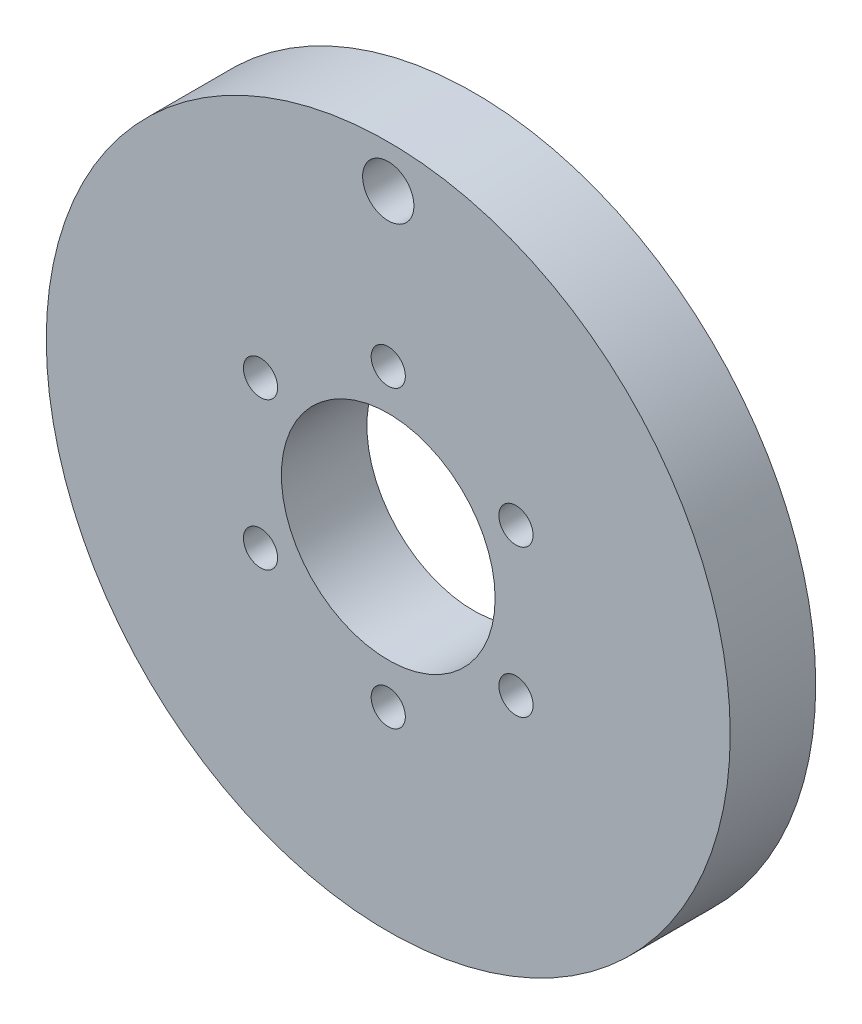
ISO-10303-21;
HEADER;
FILE_DESCRIPTION(('STEP AP214'),'2;1');
FILE_NAME('part.step','',(''),(''),'','','');
FILE_SCHEMA(('AUTOMOTIVE_DESIGN { 1 0 10303 214 1 1 1 1 }'));
ENDSEC;
DATA;
#1=APPLICATION_CONTEXT('core data for automotive mechanical design processes');
#2=APPLICATION_PROTOCOL_DEFINITION('international standard','automotive_design',2000,#1);
#3=PRODUCT_CONTEXT('',#1,'mechanical');
#4=PRODUCT('Part','Part','',(#3));
#5=PRODUCT_RELATED_PRODUCT_CATEGORY('part','',(#4));
#6=PRODUCT_DEFINITION_FORMATION('','',#4);
#7=PRODUCT_DEFINITION_CONTEXT('part definition',#1,'design');
#8=PRODUCT_DEFINITION('design','',#6,#7);
#9=PRODUCT_DEFINITION_SHAPE('','',#8);
#10=(LENGTH_UNIT() NAMED_UNIT(*) SI_UNIT(.MILLI.,.METRE.));
#11=(NAMED_UNIT(*) PLANE_ANGLE_UNIT() SI_UNIT($,.RADIAN.));
#12=(NAMED_UNIT(*) SI_UNIT($,.STERADIAN.) SOLID_ANGLE_UNIT());
#13=UNCERTAINTY_MEASURE_WITH_UNIT(LENGTH_MEASURE(1.E-05),#10,'distance_accuracy_value','');
#14=(GEOMETRIC_REPRESENTATION_CONTEXT(3) GLOBAL_UNCERTAINTY_ASSIGNED_CONTEXT((#13)) GLOBAL_UNIT_ASSIGNED_CONTEXT((#10,
#11,#12)) REPRESENTATION_CONTEXT('',''));
#15=CARTESIAN_POINT('',(0.,0.,0.));
#16=DIRECTION('',(0.,0.,1.));
#17=DIRECTION('',(1.,0.,0.));
#18=AXIS2_PLACEMENT_3D('',#15,#16,#17);
#19=CARTESIAN_POINT('',(0.,0.,10.));
#20=DIRECTION('',(0.,0.,1.));
#21=DIRECTION('',(1.,0.,0.));
#22=AXIS2_PLACEMENT_3D('',#19,#20,#21);
#23=PLANE('',#22);
#24=CARTESIAN_POINT('',(-50.4179159466278,3.25558930676027,10.));
#25=DIRECTION('',(0.,0.,1.));
#26=DIRECTION('',(1.,0.,0.));
#27=AXIS2_PLACEMENT_3D('',#24,#25,#26);
#28=CIRCLE('',#27,2.00000000000001);
#29=CARTESIAN_POINT('',(-48.4179159466278,3.25558930676027,10.));
#30=VERTEX_POINT('',#29);
#31=EDGE_CURVE('E11',#30,#30,#28,.T.);
#32=ORIENTED_EDGE('',*,*,#31,.F.);
#33=EDGE_LOOP('',(#32));
#34=FACE_BOUND('',#33,.T.);
#35=CARTESIAN_POINT('',(-35.4789777313476,11.880589306761,10.));
#36=DIRECTION('',(0.,0.,1.));
#37=DIRECTION('',(1.,0.,0.));
#38=AXIS2_PLACEMENT_3D('',#35,#36,#37);
#39=CIRCLE('',#38,40.);
#40=CARTESIAN_POINT('',(4.52102226865242,11.880589306761,10.));
#41=VERTEX_POINT('',#40);
#42=EDGE_CURVE('E51',#41,#41,#39,.T.);
#43=ORIENTED_EDGE('',*,*,#42,.T.);
#44=EDGE_LOOP('',(#43));
#45=FACE_BOUND('',#44,.T.);
#46=CARTESIAN_POINT('',(-35.4789777313476,46.880589306761,10.));
#47=DIRECTION('',(0.,0.,1.));
#48=DIRECTION('',(1.,0.,0.));
#49=AXIS2_PLACEMENT_3D('',#46,#47,#48);
#50=CIRCLE('',#49,3.);
#51=CARTESIAN_POINT('',(-32.4789777313476,46.880589306761,10.));
#52=VERTEX_POINT('',#51);
#53=EDGE_CURVE('E56',#52,#52,#50,.T.);
#54=ORIENTED_EDGE('',*,*,#53,.F.);
#55=EDGE_LOOP('',(#54));
#56=FACE_BOUND('',#55,.T.);
#57=CARTESIAN_POINT('',(-35.4789777313457,-5.36941069323902,10.));
#58=DIRECTION('',(0.,0.,1.));
#59=DIRECTION('',(1.,0.,0.));
#60=AXIS2_PLACEMENT_3D('',#57,#58,#59);
#61=CIRCLE('',#60,2.00000000000001);
#62=CARTESIAN_POINT('',(-33.4789777313457,-5.36941069323902,10.));
#63=VERTEX_POINT('',#62);
#64=EDGE_CURVE('E103',#63,#63,#61,.T.);
#65=ORIENTED_EDGE('',*,*,#64,.F.);
#66=EDGE_LOOP('',(#65));
#67=FACE_BOUND('',#66,.T.);
#68=CARTESIAN_POINT('',(-20.5400395160646,3.25558930676174,10.));
#69=DIRECTION('',(0.,0.,1.));
#70=DIRECTION('',(1.,0.,0.));
#71=AXIS2_PLACEMENT_3D('',#68,#69,#70);
#72=CIRCLE('',#71,2.);
#73=CARTESIAN_POINT('',(-18.5400395160646,3.25558930676174,10.));
#74=VERTEX_POINT('',#73);
#75=EDGE_CURVE('E100',#74,#74,#72,.T.);
#76=ORIENTED_EDGE('',*,*,#75,.F.);
#77=EDGE_LOOP('',(#76));
#78=FACE_BOUND('',#77,.T.);
#79=CARTESIAN_POINT('',(-20.5400395160655,20.5055893067618,10.));
#80=DIRECTION('',(0.,0.,1.));
#81=DIRECTION('',(1.,0.,0.));
#82=AXIS2_PLACEMENT_3D('',#79,#80,#81);
#83=CIRCLE('',#82,2.);
#84=CARTESIAN_POINT('',(-18.5400395160655,20.5055893067618,10.));
#85=VERTEX_POINT('',#84);
#86=EDGE_CURVE('E92',#85,#85,#83,.T.);
#87=ORIENTED_EDGE('',*,*,#86,.F.);
#88=EDGE_LOOP('',(#87));
#89=FACE_BOUND('',#88,.T.);
#90=CARTESIAN_POINT('',(-35.4789777313476,29.130589306761,10.));
#91=DIRECTION('',(0.,0.,1.));
#92=DIRECTION('',(1.,0.,0.));
#93=AXIS2_PLACEMENT_3D('',#90,#91,#92);
#94=CIRCLE('',#93,2.);
#95=CARTESIAN_POINT('',(-33.4789777313476,29.130589306761,10.));
#96=VERTEX_POINT('',#95);
#97=EDGE_CURVE('E87',#96,#96,#94,.T.);
#98=ORIENTED_EDGE('',*,*,#97,.F.);
#99=EDGE_LOOP('',(#98));
#100=FACE_BOUND('',#99,.T.);
#101=CARTESIAN_POINT('',(-50.4179159466286,20.5055893067603,10.));
#102=DIRECTION('',(0.,0.,1.));
#103=DIRECTION('',(1.,0.,0.));
#104=AXIS2_PLACEMENT_3D('',#101,#102,#103);
#105=CIRCLE('',#104,2.);
#106=CARTESIAN_POINT('',(-48.4179159466286,20.5055893067603,10.));
#107=VERTEX_POINT('',#106);
#108=EDGE_CURVE('E83',#107,#107,#105,.T.);
#109=ORIENTED_EDGE('',*,*,#108,.F.);
#110=EDGE_LOOP('',(#109));
#111=FACE_BOUND('',#110,.T.);
#112=CARTESIAN_POINT('',(-35.4789777313476,11.880589306761,10.));
#113=DIRECTION('',(0.,0.,1.));
#114=DIRECTION('',(1.,0.,0.));
#115=AXIS2_PLACEMENT_3D('',#112,#113,#114);
#116=CIRCLE('',#115,12.5);
#117=CARTESIAN_POINT('',(-22.9789777313476,11.880589306761,10.));
#118=VERTEX_POINT('',#117);
#119=EDGE_CURVE('E64',#118,#118,#116,.T.);
#120=ORIENTED_EDGE('',*,*,#119,.F.);
#121=EDGE_LOOP('',(#120));
#122=FACE_BOUND('',#121,.T.);
#123=ADVANCED_FACE('F43',(#34,#45,#56,#67,#78,#89,#100,#111,#122),#23,.T.);
#124=CARTESIAN_POINT('',(0.,0.,0.));
#125=DIRECTION('',(0.,0.,1.));
#126=DIRECTION('',(1.,0.,0.));
#127=AXIS2_PLACEMENT_3D('',#124,#125,#126);
#128=PLANE('',#127);
#129=CARTESIAN_POINT('',(-50.4179159466286,20.5055893067603,0.));
#130=DIRECTION('',(0.,0.,1.));
#131=DIRECTION('',(1.,0.,0.));
#132=AXIS2_PLACEMENT_3D('',#129,#130,#131);
#133=CIRCLE('',#132,2.);
#134=CARTESIAN_POINT('',(-48.4179159466286,20.5055893067603,0.));
#135=VERTEX_POINT('',#134);
#136=EDGE_CURVE('E60',#135,#135,#133,.T.);
#137=ORIENTED_EDGE('',*,*,#136,.T.);
#138=EDGE_LOOP('',(#137));
#139=FACE_BOUND('',#138,.T.);
#140=CARTESIAN_POINT('',(-35.4789777313476,29.130589306761,0.));
#141=DIRECTION('',(0.,0.,1.));
#142=DIRECTION('',(1.,0.,0.));
#143=AXIS2_PLACEMENT_3D('',#140,#141,#142);
#144=CIRCLE('',#143,2.);
#145=CARTESIAN_POINT('',(-33.4789777313476,29.130589306761,0.));
#146=VERTEX_POINT('',#145);
#147=EDGE_CURVE('E63',#146,#146,#144,.T.);
#148=ORIENTED_EDGE('',*,*,#147,.T.);
#149=EDGE_LOOP('',(#148));
#150=FACE_BOUND('',#149,.T.);
#151=CARTESIAN_POINT('',(-20.5400395160655,20.5055893067618,0.));
#152=DIRECTION('',(0.,0.,1.));
#153=DIRECTION('',(1.,0.,0.));
#154=AXIS2_PLACEMENT_3D('',#151,#152,#153);
#155=CIRCLE('',#154,2.);
#156=CARTESIAN_POINT('',(-18.5400395160655,20.5055893067618,0.));
#157=VERTEX_POINT('',#156);
#158=EDGE_CURVE('E67',#157,#157,#155,.T.);
#159=ORIENTED_EDGE('',*,*,#158,.T.);
#160=EDGE_LOOP('',(#159));
#161=FACE_BOUND('',#160,.T.);
#162=CARTESIAN_POINT('',(-20.5400395160646,3.25558930676174,0.));
#163=DIRECTION('',(0.,0.,1.));
#164=DIRECTION('',(1.,0.,0.));
#165=AXIS2_PLACEMENT_3D('',#162,#163,#164);
#166=CIRCLE('',#165,2.);
#167=CARTESIAN_POINT('',(-18.5400395160646,3.25558930676174,0.));
#168=VERTEX_POINT('',#167);
#169=EDGE_CURVE('E70',#168,#168,#166,.T.);
#170=ORIENTED_EDGE('',*,*,#169,.T.);
#171=EDGE_LOOP('',(#170));
#172=FACE_BOUND('',#171,.T.);
#173=CARTESIAN_POINT('',(-35.4789777313457,-5.36941069323902,0.));
#174=DIRECTION('',(0.,0.,1.));
#175=DIRECTION('',(1.,0.,0.));
#176=AXIS2_PLACEMENT_3D('',#173,#174,#175);
#177=CIRCLE('',#176,2.00000000000001);
#178=CARTESIAN_POINT('',(-33.4789777313457,-5.36941069323902,0.));
#179=VERTEX_POINT('',#178);
#180=EDGE_CURVE('E73',#179,#179,#177,.T.);
#181=ORIENTED_EDGE('',*,*,#180,.T.);
#182=EDGE_LOOP('',(#181));
#183=FACE_BOUND('',#182,.T.);
#184=CARTESIAN_POINT('',(-35.4789777313476,46.880589306761,0.));
#185=DIRECTION('',(0.,0.,1.));
#186=DIRECTION('',(1.,0.,0.));
#187=AXIS2_PLACEMENT_3D('',#184,#185,#186);
#188=CIRCLE('',#187,3.);
#189=CARTESIAN_POINT('',(-32.4789777313476,46.880589306761,0.));
#190=VERTEX_POINT('',#189);
#191=EDGE_CURVE('E76',#190,#190,#188,.T.);
#192=ORIENTED_EDGE('',*,*,#191,.T.);
#193=EDGE_LOOP('',(#192));
#194=FACE_BOUND('',#193,.T.);
#195=CARTESIAN_POINT('',(-35.4789777313476,11.880589306761,0.));
#196=DIRECTION('',(0.,0.,1.));
#197=DIRECTION('',(1.,0.,0.));
#198=AXIS2_PLACEMENT_3D('',#195,#196,#197);
#199=CIRCLE('',#198,40.);
#200=CARTESIAN_POINT('',(4.52102226865242,11.880589306761,0.));
#201=VERTEX_POINT('',#200);
#202=EDGE_CURVE('E78',#201,#201,#199,.T.);
#203=ORIENTED_EDGE('',*,*,#202,.F.);
#204=EDGE_LOOP('',(#203));
#205=FACE_BOUND('',#204,.T.);
#206=CARTESIAN_POINT('',(-50.4179159466278,3.25558930676027,0.));
#207=DIRECTION('',(0.,0.,1.));
#208=DIRECTION('',(1.,0.,0.));
#209=AXIS2_PLACEMENT_3D('',#206,#207,#208);
#210=CIRCLE('',#209,2.00000000000001);
#211=CARTESIAN_POINT('',(-48.4179159466278,3.25558930676027,0.));
#212=VERTEX_POINT('',#211);
#213=EDGE_CURVE('E47',#212,#212,#210,.T.);
#214=ORIENTED_EDGE('',*,*,#213,.T.);
#215=EDGE_LOOP('',(#214));
#216=FACE_BOUND('',#215,.T.);
#217=CARTESIAN_POINT('',(-35.4789777313476,11.880589306761,0.));
#218=DIRECTION('',(0.,0.,1.));
#219=DIRECTION('',(1.,0.,0.));
#220=AXIS2_PLACEMENT_3D('',#217,#218,#219);
#221=CIRCLE('',#220,12.5);
#222=CARTESIAN_POINT('',(-22.9789777313476,11.880589306761,0.));
#223=VERTEX_POINT('',#222);
#224=EDGE_CURVE('E95',#223,#223,#221,.T.);
#225=ORIENTED_EDGE('',*,*,#224,.T.);
#226=EDGE_LOOP('',(#225));
#227=FACE_BOUND('',#226,.T.);
#228=ADVANCED_FACE('F113',(#139,#150,#161,#172,#183,#194,#205,#216,#227),#128,.F.);
#229=CARTESIAN_POINT('',(-35.4789777313476,11.880589306761,10.));
#230=DIRECTION('',(0.,0.,-1.));
#231=DIRECTION('',(-1.,0.,0.));
#232=AXIS2_PLACEMENT_3D('',#229,#230,#231);
#233=CYLINDRICAL_SURFACE('',#232,40.);
#234=ORIENTED_EDGE('',*,*,#42,.F.);
#235=EDGE_LOOP('',(#234));
#236=FACE_BOUND('',#235,.T.);
#237=ORIENTED_EDGE('',*,*,#202,.T.);
#238=EDGE_LOOP('',(#237));
#239=FACE_BOUND('',#238,.T.);
#240=ADVANCED_FACE('F142',(#236,#239),#233,.T.);
#241=CARTESIAN_POINT('',(-35.4789777313476,46.880589306761,10.));
#242=DIRECTION('',(0.,0.,-1.));
#243=DIRECTION('',(-1.,0.,0.));
#244=AXIS2_PLACEMENT_3D('',#241,#242,#243);
#245=CYLINDRICAL_SURFACE('',#244,3.);
#246=ORIENTED_EDGE('',*,*,#53,.T.);
#247=EDGE_LOOP('',(#246));
#248=FACE_BOUND('',#247,.T.);
#249=ORIENTED_EDGE('',*,*,#191,.F.);
#250=EDGE_LOOP('',(#249));
#251=FACE_BOUND('',#250,.T.);
#252=ADVANCED_FACE('F108',(#248,#251),#245,.F.);
#253=CARTESIAN_POINT('',(-35.4789777313457,-5.36941069323902,10.));
#254=DIRECTION('',(0.,0.,-1.));
#255=DIRECTION('',(-1.,0.,0.));
#256=AXIS2_PLACEMENT_3D('',#253,#254,#255);
#257=CYLINDRICAL_SURFACE('',#256,2.00000000000001);
#258=ORIENTED_EDGE('',*,*,#64,.T.);
#259=EDGE_LOOP('',(#258));
#260=FACE_BOUND('',#259,.T.);
#261=ORIENTED_EDGE('',*,*,#180,.F.);
#262=EDGE_LOOP('',(#261));
#263=FACE_BOUND('',#262,.T.);
#264=ADVANCED_FACE('F150',(#260,#263),#257,.F.);
#265=CARTESIAN_POINT('',(-20.5400395160646,3.25558930676174,10.));
#266=DIRECTION('',(0.,0.,-1.));
#267=DIRECTION('',(-1.,0.,0.));
#268=AXIS2_PLACEMENT_3D('',#265,#266,#267);
#269=CYLINDRICAL_SURFACE('',#268,2.);
#270=ORIENTED_EDGE('',*,*,#75,.T.);
#271=EDGE_LOOP('',(#270));
#272=FACE_BOUND('',#271,.T.);
#273=ORIENTED_EDGE('',*,*,#169,.F.);
#274=EDGE_LOOP('',(#273));
#275=FACE_BOUND('',#274,.T.);
#276=ADVANCED_FACE('F153',(#272,#275),#269,.F.);
#277=CARTESIAN_POINT('',(-20.5400395160655,20.5055893067618,10.));
#278=DIRECTION('',(0.,0.,-1.));
#279=DIRECTION('',(-1.,0.,0.));
#280=AXIS2_PLACEMENT_3D('',#277,#278,#279);
#281=CYLINDRICAL_SURFACE('',#280,2.);
#282=ORIENTED_EDGE('',*,*,#86,.T.);
#283=EDGE_LOOP('',(#282));
#284=FACE_BOUND('',#283,.T.);
#285=ORIENTED_EDGE('',*,*,#158,.F.);
#286=EDGE_LOOP('',(#285));
#287=FACE_BOUND('',#286,.T.);
#288=ADVANCED_FACE('F157',(#284,#287),#281,.F.);
#289=CARTESIAN_POINT('',(-35.4789777313476,29.130589306761,10.));
#290=DIRECTION('',(0.,0.,-1.));
#291=DIRECTION('',(-1.,0.,0.));
#292=AXIS2_PLACEMENT_3D('',#289,#290,#291);
#293=CYLINDRICAL_SURFACE('',#292,2.);
#294=ORIENTED_EDGE('',*,*,#97,.T.);
#295=EDGE_LOOP('',(#294));
#296=FACE_BOUND('',#295,.T.);
#297=ORIENTED_EDGE('',*,*,#147,.F.);
#298=EDGE_LOOP('',(#297));
#299=FACE_BOUND('',#298,.T.);
#300=ADVANCED_FACE('F160',(#296,#299),#293,.F.);
#301=CARTESIAN_POINT('',(-50.4179159466286,20.5055893067603,10.));
#302=DIRECTION('',(0.,0.,-1.));
#303=DIRECTION('',(-1.,0.,0.));
#304=AXIS2_PLACEMENT_3D('',#301,#302,#303);
#305=CYLINDRICAL_SURFACE('',#304,2.);
#306=ORIENTED_EDGE('',*,*,#108,.T.);
#307=EDGE_LOOP('',(#306));
#308=FACE_BOUND('',#307,.T.);
#309=ORIENTED_EDGE('',*,*,#136,.F.);
#310=EDGE_LOOP('',(#309));
#311=FACE_BOUND('',#310,.T.);
#312=ADVANCED_FACE('F45',(#308,#311),#305,.F.);
#313=CARTESIAN_POINT('',(-50.4179159466278,3.25558930676027,10.));
#314=DIRECTION('',(0.,0.,-1.));
#315=DIRECTION('',(-1.,0.,0.));
#316=AXIS2_PLACEMENT_3D('',#313,#314,#315);
#317=CYLINDRICAL_SURFACE('',#316,2.00000000000001);
#318=ORIENTED_EDGE('',*,*,#31,.T.);
#319=EDGE_LOOP('',(#318));
#320=FACE_BOUND('',#319,.T.);
#321=ORIENTED_EDGE('',*,*,#213,.F.);
#322=EDGE_LOOP('',(#321));
#323=FACE_BOUND('',#322,.T.);
#324=ADVANCED_FACE('F134',(#320,#323),#317,.F.);
#325=CARTESIAN_POINT('',(-35.4789777313476,11.880589306761,10.));
#326=DIRECTION('',(0.,0.,-1.));
#327=DIRECTION('',(-1.,0.,0.));
#328=AXIS2_PLACEMENT_3D('',#325,#326,#327);
#329=CYLINDRICAL_SURFACE('',#328,12.5);
#330=ORIENTED_EDGE('',*,*,#119,.T.);
#331=EDGE_LOOP('',(#330));
#332=FACE_BOUND('',#331,.T.);
#333=ORIENTED_EDGE('',*,*,#224,.F.);
#334=EDGE_LOOP('',(#333));
#335=FACE_BOUND('',#334,.T.);
#336=ADVANCED_FACE('F132',(#332,#335),#329,.F.);
#337=CLOSED_SHELL('',(#123,#228,#240,#252,#264,#276,#288,#300,#312,#324,#336));
#338=MANIFOLD_SOLID_BREP('B2',#337);
#339=ADVANCED_BREP_SHAPE_REPRESENTATION('',(#18,#338),#14);
#340=SHAPE_DEFINITION_REPRESENTATION(#9,#339);
ENDSEC;
END-ISO-10303-21;
